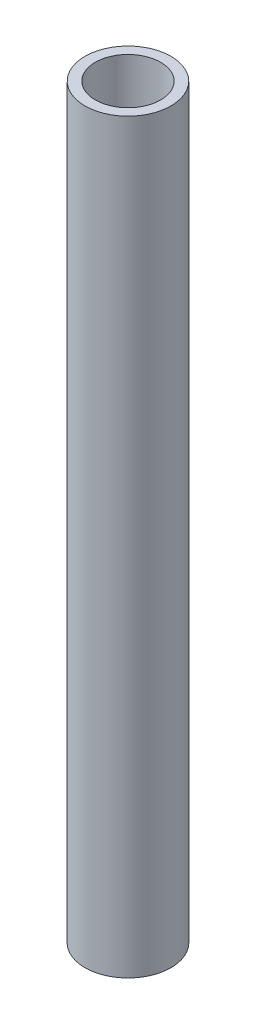
ISO-10303-21;
HEADER;
FILE_DESCRIPTION(('STEP AP214'),'2;1');
FILE_NAME('part.step','',(''),(''),'','','');
FILE_SCHEMA(('AUTOMOTIVE_DESIGN { 1 0 10303 214 1 1 1 1 }'));
ENDSEC;
DATA;
#1=APPLICATION_CONTEXT('core data for automotive mechanical design processes');
#2=APPLICATION_PROTOCOL_DEFINITION('international standard','automotive_design',2000,#1);
#3=PRODUCT_CONTEXT('',#1,'mechanical');
#4=PRODUCT('Part','Part','',(#3));
#5=PRODUCT_RELATED_PRODUCT_CATEGORY('part','',(#4));
#6=PRODUCT_DEFINITION_FORMATION('','',#4);
#7=PRODUCT_DEFINITION_CONTEXT('part definition',#1,'design');
#8=PRODUCT_DEFINITION('design','',#6,#7);
#9=PRODUCT_DEFINITION_SHAPE('','',#8);
#10=(LENGTH_UNIT() NAMED_UNIT(*) SI_UNIT(.MILLI.,.METRE.));
#11=(NAMED_UNIT(*) PLANE_ANGLE_UNIT() SI_UNIT($,.RADIAN.));
#12=(NAMED_UNIT(*) SI_UNIT($,.STERADIAN.) SOLID_ANGLE_UNIT());
#13=UNCERTAINTY_MEASURE_WITH_UNIT(LENGTH_MEASURE(1.E-05),#10,'distance_accuracy_value','');
#14=(GEOMETRIC_REPRESENTATION_CONTEXT(3) GLOBAL_UNCERTAINTY_ASSIGNED_CONTEXT((#13)) GLOBAL_UNIT_ASSIGNED_CONTEXT((#10,
#11,#12)) REPRESENTATION_CONTEXT('',''));
#15=CARTESIAN_POINT('',(0.,0.,0.));
#16=DIRECTION('',(0.,0.,1.));
#17=DIRECTION('',(1.,0.,0.));
#18=AXIS2_PLACEMENT_3D('',#15,#16,#17);
#19=CARTESIAN_POINT('',(0.,217.,0.));
#20=DIRECTION('',(0.,1.,0.));
#21=DIRECTION('',(0.,0.,1.));
#22=AXIS2_PLACEMENT_3D('',#19,#20,#21);
#23=PLANE('',#22);
#24=CARTESIAN_POINT('',(0.,217.,0.));
#25=DIRECTION('',(0.,1.,0.));
#26=DIRECTION('',(0.,0.,1.));
#27=AXIS2_PLACEMENT_3D('',#24,#25,#26);
#28=CIRCLE('',#27,12.5);
#29=CARTESIAN_POINT('',(0.,217.,12.5));
#30=VERTEX_POINT('',#29);
#31=EDGE_CURVE('E10',#30,#30,#28,.T.);
#32=ORIENTED_EDGE('',*,*,#31,.T.);
#33=EDGE_LOOP('',(#32));
#34=FACE_BOUND('',#33,.T.);
#35=CARTESIAN_POINT('',(0.,217.,0.));
#36=DIRECTION('',(0.,1.,0.));
#37=DIRECTION('',(0.,0.,1.));
#38=AXIS2_PLACEMENT_3D('',#35,#36,#37);
#39=CIRCLE('',#38,9.5);
#40=CARTESIAN_POINT('',(0.,217.,9.5));
#41=VERTEX_POINT('',#40);
#42=EDGE_CURVE('E51',#41,#41,#39,.T.);
#43=ORIENTED_EDGE('',*,*,#42,.F.);
#44=EDGE_LOOP('',(#43));
#45=FACE_BOUND('',#44,.T.);
#46=ADVANCED_FACE('F32',(#34,#45),#23,.T.);
#47=CARTESIAN_POINT('',(0.,0.,0.));
#48=DIRECTION('',(0.,1.,0.));
#49=DIRECTION('',(0.,0.,1.));
#50=AXIS2_PLACEMENT_3D('',#47,#48,#49);
#51=PLANE('',#50);
#52=CARTESIAN_POINT('',(0.,0.,0.));
#53=DIRECTION('',(0.,1.,0.));
#54=DIRECTION('',(0.,0.,1.));
#55=AXIS2_PLACEMENT_3D('',#52,#53,#54);
#56=CIRCLE('',#55,12.5);
#57=CARTESIAN_POINT('',(0.,0.,12.5));
#58=VERTEX_POINT('',#57);
#59=EDGE_CURVE('E46',#58,#58,#56,.T.);
#60=ORIENTED_EDGE('',*,*,#59,.F.);
#61=EDGE_LOOP('',(#60));
#62=FACE_BOUND('',#61,.T.);
#63=CARTESIAN_POINT('',(0.,0.,0.));
#64=DIRECTION('',(0.,1.,0.));
#65=DIRECTION('',(0.,0.,1.));
#66=AXIS2_PLACEMENT_3D('',#63,#64,#65);
#67=CIRCLE('',#66,9.5);
#68=CARTESIAN_POINT('',(0.,0.,9.5));
#69=VERTEX_POINT('',#68);
#70=EDGE_CURVE('E53',#69,#69,#67,.T.);
#71=ORIENTED_EDGE('',*,*,#70,.T.);
#72=EDGE_LOOP('',(#71));
#73=FACE_BOUND('',#72,.T.);
#74=ADVANCED_FACE('F74',(#62,#73),#51,.F.);
#75=CARTESIAN_POINT('',(0.,217.,0.));
#76=DIRECTION('',(0.,-1.,0.));
#77=DIRECTION('',(0.,0.,-1.));
#78=AXIS2_PLACEMENT_3D('',#75,#76,#77);
#79=CYLINDRICAL_SURFACE('',#78,12.5);
#80=CARTESIAN_POINT('',(0.,205.,-12.5));
#81=CARTESIAN_POINT('',(-0.165963929028716,204.999994975923,-12.4999970714968));
#82=CARTESIAN_POINT('',(-0.331985420928068,204.986181589764,-12.4966615634859));
#83=CARTESIAN_POINT('',(-0.659284290971382,204.931367260405,-12.4836783946933));
#84=CARTESIAN_POINT('',(-0.820558683214276,204.890349572005,-12.4740268462166));
#85=CARTESIAN_POINT('',(-1.13358839471402,204.782507665496,-12.4494823208195));
#86=CARTESIAN_POINT('',(-1.28535442324823,204.715713110142,-12.4345953702841));
#87=CARTESIAN_POINT('',(-1.57552517879764,204.558314563554,-12.4011725442513));
#88=CARTESIAN_POINT('',(-1.71392971475167,204.467710231923,-12.3826366165873));
#89=CARTESIAN_POINT('',(-1.97609263393973,204.263435821624,-12.3435386014785));
#90=CARTESIAN_POINT('',(-2.09955952100481,204.149397218951,-12.3229472454311));
#91=CARTESIAN_POINT('',(-2.32581080811943,203.902281130935,-12.2822574370147));
#92=CARTESIAN_POINT('',(-2.4285930462449,203.769201657959,-12.2621590363612));
#93=CARTESIAN_POINT('',(-2.61189993555015,203.485554166983,-12.224437969062));
#94=CARTESIAN_POINT('',(-2.69210377047565,203.334773416241,-12.2068525815312));
#95=CARTESIAN_POINT('',(-2.82591582947333,203.021380164872,-12.1765733412448));
#96=CARTESIAN_POINT('',(-2.87952794169564,202.858769397977,-12.1638787734309));
#97=CARTESIAN_POINT('',(-2.95765058108663,202.529523426731,-12.1451184675007));
#98=CARTESIAN_POINT('',(-2.98268262400617,202.363018878475,-12.1389341034343));
#99=CARTESIAN_POINT('',(-3.00455808879087,202.028067620357,-12.1335389605945));
#100=CARTESIAN_POINT('',(-3.001405716824,201.859621204043,-12.1343271412568));
#101=CARTESIAN_POINT('',(-2.96741912081942,201.529524033987,-12.1426811387008));
#102=CARTESIAN_POINT('',(-2.93720103400494,201.36780543481,-12.1500960921292));
#103=CARTESIAN_POINT('',(-2.85092141637188,201.051802683352,-12.1706283738785));
#104=CARTESIAN_POINT('',(-2.79485817372027,200.897519024266,-12.1837460799133));
#105=CARTESIAN_POINT('',(-2.65794121231783,200.599087021916,-12.2143476734445));
#106=CARTESIAN_POINT('',(-2.57685948246961,200.455047547083,-12.2318714325758));
#107=CARTESIAN_POINT('',(-2.39236688956384,200.182395499277,-12.2692875046196));
#108=CARTESIAN_POINT('',(-2.28895240342649,200.053785434715,-12.2891802016137));
#109=CARTESIAN_POINT('',(-2.05951493908849,199.812106429681,-12.329732025739));
#110=CARTESIAN_POINT('',(-1.9329706438991,199.699532900938,-12.3503975788014));
#111=CARTESIAN_POINT('',(-1.66255592459693,199.497115280254,-12.3896951594929));
#112=CARTESIAN_POINT('',(-1.51868504982142,199.407271779707,-12.4083271342049));
#113=CARTESIAN_POINT('',(-1.21702847718582,199.252702779387,-12.4415394956922));
#114=CARTESIAN_POINT('',(-1.05920278696055,199.188052543762,-12.4561077058019));
#115=CARTESIAN_POINT('',(-0.734497606078679,199.086334920951,-12.4794620474154));
#116=CARTESIAN_POINT('',(-0.567619713387665,199.049262682373,-12.4882491958651));
#117=CARTESIAN_POINT('',(-0.233787399651664,199.004497935348,-12.4989027542709));
#118=CARTESIAN_POINT('',(-0.0669284805450043,198.996130107538,-12.5009282130753));
#119=CARTESIAN_POINT('',(0.265804381586635,199.007166766851,-12.4982807419474));
#120=CARTESIAN_POINT('',(0.431678404764957,199.026568961987,-12.4936083648176));
#121=CARTESIAN_POINT('',(0.755422580108857,199.092036978516,-12.4781916395217));
#122=CARTESIAN_POINT('',(0.913370579311319,199.137739109574,-12.4675301590363));
#123=CARTESIAN_POINT('',(1.21935330013478,199.254098191695,-12.4413335015664));
#124=CARTESIAN_POINT('',(1.36738706664151,199.324757542978,-12.4257978558334));
#125=CARTESIAN_POINT('',(1.6520615099557,199.490366593598,-12.3911910149582));
#126=CARTESIAN_POINT('',(1.78847176740355,199.585700716924,-12.3720653178033));
#127=CARTESIAN_POINT('',(2.04359904096632,199.797456929013,-12.3324936406987));
#128=CARTESIAN_POINT('',(2.16231325074336,199.913882356081,-12.3120474520734));
#129=CARTESIAN_POINT('',(2.38142453789942,200.167640831209,-12.2715742142771));
#130=CARTESIAN_POINT('',(2.48134974047371,200.305385122082,-12.2515669262668));
#131=CARTESIAN_POINT('',(2.65666020824083,200.596090427897,-12.2147538797452));
#132=CARTESIAN_POINT('',(2.73204657223351,200.749050761094,-12.1979479778962));
#133=CARTESIAN_POINT('',(2.85558993518172,201.065012513544,-12.1696189519335));
#134=CARTESIAN_POINT('',(2.90390754385905,201.227948203421,-12.1580647463107));
#135=CARTESIAN_POINT('',(2.97238380283979,201.559946185021,-12.1415072663683));
#136=CARTESIAN_POINT('',(2.99254804274991,201.729007253762,-12.1365026916888));
#137=CARTESIAN_POINT('',(3.00387066449354,202.063670700281,-12.1337046220624));
#138=CARTESIAN_POINT('',(2.99578106592266,202.229246496327,-12.1357241633848));
#139=CARTESIAN_POINT('',(2.95253345626267,202.556599764224,-12.1463176460425));
#140=CARTESIAN_POINT('',(2.91737590900096,202.718377301111,-12.1548914750658));
#141=CARTESIAN_POINT('',(2.82138591303537,203.032797552548,-12.1775274976748));
#142=CARTESIAN_POINT('',(2.76068402045612,203.185482272584,-12.191561756094));
#143=CARTESIAN_POINT('',(2.61543373580583,203.478604413884,-12.2235433612686));
#144=CARTESIAN_POINT('',(2.53088229934855,203.619040268586,-12.2414912075257));
#145=CARTESIAN_POINT('',(2.33793007708464,203.88733700012,-12.279819325529));
#146=CARTESIAN_POINT('',(2.22900267979019,204.014812323099,-12.3002478697533));
#147=CARTESIAN_POINT('',(1.99143074773236,204.249919988052,-12.3409359831145));
#148=CARTESIAN_POINT('',(1.86278158874233,204.35754766321,-12.361195511444));
#149=CARTESIAN_POINT('',(1.58688299880138,204.551609259555,-12.3996570299581));
#150=CARTESIAN_POINT('',(1.439364143594,204.637668405442,-12.4178200201219));
#151=CARTESIAN_POINT('',(1.13153622828565,204.783629532748,-12.4496380610582));
#152=CARTESIAN_POINT('',(0.971236973691203,204.843551343392,-12.4632965272855));
#153=CARTESIAN_POINT('',(0.67588702569475,204.926038625138,-12.4824059901497));
#154=CARTESIAN_POINT('',(0.542312066268408,204.953716615786,-12.4889599449579));
#155=CARTESIAN_POINT('',(0.272504227478243,204.990698780852,-12.4977580149525));
#156=CARTESIAN_POINT('',(0.136271517915774,205.000004125226,-12.5000024045682));
#157=CARTESIAN_POINT('',(0.,205.,-12.5));
#158=B_SPLINE_CURVE_WITH_KNOTS('',3,(#80,#81,#82,#83,#84,#85,#86,#87,#88,#89,#90,#91,#92,#93,
#94,#95,#96,#97,#98,#99,#100,#101,#102,#103,#104,#105,#106,#107,#108,#109,#110,#111,#112,#113,
#114,#115,#116,#117,#118,#119,#120,#121,#122,#123,#124,#125,#126,#127,#128,#129,#130,#131,#132,
#133,#134,#135,#136,#137,#138,#139,#140,#141,#142,#143,#144,#145,#146,#147,#148,#149,#150,#151,
#152,#153,#154,#155,#156,#157),.UNSPECIFIED.,.T.,.F.,(4,2,2,2,2,2,2,2,2,2,2,2,2,2,2,2,2,2,2,2,2,
2,2,2,2,2,2,2,2,2,2,2,2,2,2,2,2,2,4),(0.,0.497392599366678,0.995091645758828,1.49221966408503,
1.98935478998521,2.49500570148358,3.00070943533307,3.51327262050848,4.02576083835036,
4.52873995359111,5.03164400680469,5.52338274964841,6.01515406709136,6.51154667521171,
7.00801987450002,7.51749958381933,8.0269925475217,8.53799614678203,9.04890983140416,
9.54771776810827,10.0464845383097,10.5385143736981,11.0305915421211,11.5308523313794,
12.031192370573,12.5427824523193,13.0543496229378,13.5628484119093,14.0712462285019,
14.5662165454702,15.06117838098,15.5536406351284,16.0461657803879,16.5505844610431,
17.055121595827,17.5678974206352,18.0802835459069,18.4887142303991,18.897118905514),.UNSPECIFIED.);
#159=CARTESIAN_POINT('',(0.,205.,-12.5));
#160=VERTEX_POINT('',#159);
#161=EDGE_CURVE('E56',#160,#160,#158,.T.);
#162=ORIENTED_EDGE('',*,*,#161,.T.);
#163=EDGE_LOOP('',(#162));
#164=FACE_BOUND('',#163,.T.);
#165=ORIENTED_EDGE('',*,*,#31,.F.);
#166=EDGE_LOOP('',(#165));
#167=FACE_BOUND('',#166,.T.);
#168=ORIENTED_EDGE('',*,*,#59,.T.);
#169=EDGE_LOOP('',(#168));
#170=FACE_BOUND('',#169,.T.);
#171=ADVANCED_FACE('F34',(#164,#167,#170),#79,.T.);
#172=CARTESIAN_POINT('',(0.,217.,0.));
#173=DIRECTION('',(0.,-1.,0.));
#174=DIRECTION('',(0.,0.,-1.));
#175=AXIS2_PLACEMENT_3D('',#172,#173,#174);
#176=CYLINDRICAL_SURFACE('',#175,9.5);
#177=CARTESIAN_POINT('',(0.,205.,-9.5));
#178=CARTESIAN_POINT('',(-0.164167089462808,204.999999192006,-9.49999935809229));
#179=CARTESIAN_POINT('',(-0.328342993003652,204.986480261011,-9.49570457873447));
#180=CARTESIAN_POINT('',(-0.651888233262993,204.932907101554,-9.47899296182889));
#181=CARTESIAN_POINT('',(-0.811256566918247,204.892847375045,-9.46657444141809));
#182=CARTESIAN_POINT('',(-1.12047453900869,204.787682087632,-9.43497086374047));
#183=CARTESIAN_POINT('',(-1.2703386681819,204.722615777786,-9.4157964146812));
#184=CARTESIAN_POINT('',(-1.55702915841443,204.569452927143,-9.37265725199131));
#185=CARTESIAN_POINT('',(-1.69385337678599,204.481352610323,-9.34869175310374));
#186=CARTESIAN_POINT('',(-1.954886157509,204.281705325147,-9.29766753324294));
#187=CARTESIAN_POINT('',(-2.07862693177764,204.169564302526,-9.2705403669451));
#188=CARTESIAN_POINT('',(-2.3058948522785,203.926283439754,-9.21664353803553));
#189=CARTESIAN_POINT('',(-2.40941813390019,203.795139975581,-9.18987394468381));
#190=CARTESIAN_POINT('',(-2.59586933707153,203.513502435768,-9.1389859370637));
#191=CARTESIAN_POINT('',(-2.67820924038344,203.362602393112,-9.11495183979177));
#192=CARTESIAN_POINT('',(-2.81614778654471,203.048215076448,-9.07328724171044));
#193=CARTESIAN_POINT('',(-2.87175364335561,202.884731211909,-9.05565501372426));
#194=CARTESIAN_POINT('',(-2.9529272821257,202.555102195261,-9.02950721227384));
#195=CARTESIAN_POINT('',(-2.97936420548709,202.389192531182,-9.02072856266505));
#196=CARTESIAN_POINT('',(-3.00416514791963,202.05507820356,-9.01250122204869));
#197=CARTESIAN_POINT('',(-3.00253681210414,201.886874177487,-9.01304999020652));
#198=CARTESIAN_POINT('',(-2.97193247609429,201.560168962322,-9.02318352274045));
#199=CARTESIAN_POINT('',(-2.94406576248244,201.401550567518,-9.03240174793261));
#200=CARTESIAN_POINT('',(-2.86357596011184,201.091366945115,-9.05823941484151));
#201=CARTESIAN_POINT('',(-2.81095018945964,200.93980248355,-9.07485965833217));
#202=CARTESIAN_POINT('',(-2.68166168169204,200.645405464249,-9.11390651918069));
#203=CARTESIAN_POINT('',(-2.60465367716268,200.50273595369,-9.13641567799888));
#204=CARTESIAN_POINT('',(-2.42902643383231,200.231982351301,-9.1846668373259));
#205=CARTESIAN_POINT('',(-2.33040148183896,200.103902128931,-9.21040969170622));
#206=CARTESIAN_POINT('',(-2.10891443526094,199.859697277003,-9.26369376405774));
#207=CARTESIAN_POINT('',(-1.98513792318252,199.744406541852,-9.29126291800172));
#208=CARTESIAN_POINT('',(-1.71966506786239,199.53601351946,-9.34403785217591));
#209=CARTESIAN_POINT('',(-1.57796734157916,199.442912946311,-9.36924344974064));
#210=CARTESIAN_POINT('',(-1.27904248860848,199.28096191105,-9.41472566771743));
#211=CARTESIAN_POINT('',(-1.12169880645912,199.212314107951,-9.43496068381886));
#212=CARTESIAN_POINT('',(-0.796908546050014,199.102710444396,-9.46792126212738));
#213=CARTESIAN_POINT('',(-0.629465120716916,199.061745990021,-9.48064915466278));
#214=CARTESIAN_POINT('',(-0.296303884002123,199.010101081722,-9.49678470779038));
#215=CARTESIAN_POINT('',(-0.130777575905979,198.998292068395,-9.50053950796354));
#216=CARTESIAN_POINT('',(0.19991137896084,199.002106234833,-9.49933471585785));
#217=CARTESIAN_POINT('',(0.365074076408763,199.017725312924,-9.49437642655838));
#218=CARTESIAN_POINT('',(0.685969212904214,199.075048179768,-9.47653086922814));
#219=CARTESIAN_POINT('',(0.841834706561398,199.116077182559,-9.46384885282509));
#220=CARTESIAN_POINT('',(1.14442314350255,199.222228746273,-9.43204434547225));
#221=CARTESIAN_POINT('',(1.2911449480725,199.287354301094,-9.41292105424678));
#222=CARTESIAN_POINT('',(1.57531276244697,199.441646180127,-9.36960895031318));
#223=CARTESIAN_POINT('',(1.71244019799074,199.531366514146,-9.34530669896614));
#224=CARTESIAN_POINT('',(1.97006979650918,199.731638642252,-9.29441218727718));
#225=CARTESIAN_POINT('',(2.09056734431474,199.842196199082,-9.26781929454284));
#226=CARTESIAN_POINT('',(2.31658675579944,200.086313193485,-9.21398298633844));
#227=CARTESIAN_POINT('',(2.42130400734894,200.220623121143,-9.186756871098));
#228=CARTESIAN_POINT('',(2.60679013327421,200.505500077087,-9.13585946270641));
#229=CARTESIAN_POINT('',(2.68755931108111,200.656066899359,-9.11218812451676));
#230=CARTESIAN_POINT('',(2.8223709751743,200.968923897761,-9.07133925816319));
#231=CARTESIAN_POINT('',(2.87651039405967,201.131169053849,-9.05413823262218));
#232=CARTESIAN_POINT('',(2.95649944180757,201.463129600245,-9.0283393693878));
#233=CARTESIAN_POINT('',(2.98236013155669,201.632842042776,-9.01973816808891));
#234=CARTESIAN_POINT('',(3.0042524121147,201.96649385186,-9.01246833575292));
#235=CARTESIAN_POINT('',(3.00160628169283,202.130337919997,-9.01335938768915));
#236=CARTESIAN_POINT('',(2.96976166390158,202.455123315773,-9.02390107112083));
#237=CARTESIAN_POINT('',(2.94056446477843,202.616064783858,-9.0335512776259));
#238=CARTESIAN_POINT('',(2.85733979857869,202.928056941565,-9.06021304876319));
#239=CARTESIAN_POINT('',(2.80369834624607,203.079221145577,-9.07710994083738));
#240=CARTESIAN_POINT('',(2.67341300631293,203.370523991578,-9.11632984499269));
#241=CARTESIAN_POINT('',(2.59676436934434,203.510660349545,-9.13865397723677));
#242=CARTESIAN_POINT('',(2.41907080260918,203.781973490595,-9.1873223558432));
#243=CARTESIAN_POINT('',(2.31717569257862,203.912571016537,-9.21379131671489));
#244=CARTESIAN_POINT('',(2.09336848130777,204.155241675261,-9.26720162412938));
#245=CARTESIAN_POINT('',(1.97145098067161,204.267309794854,-9.29414309633804));
#246=CARTESIAN_POINT('',(1.7061326528479,204.47351384861,-9.34654886057908));
#247=CARTESIAN_POINT('',(1.56214764703045,204.566920781459,-9.37193310874742));
#248=CARTESIAN_POINT('',(1.25971894568572,204.728083368742,-9.41734758486009));
#249=CARTESIAN_POINT('',(1.10128066394409,204.795848579269,-9.43737980656471));
#250=CARTESIAN_POINT('',(0.787271829955636,204.899197538206,-9.468532861615));
#251=CARTESIAN_POINT('',(0.63245026637288,204.936887759171,-9.48022921021867));
#252=CARTESIAN_POINT('',(0.318421271901135,204.987286725329,-9.49596227615521));
#253=CARTESIAN_POINT('',(0.159214781112171,205.00000078362,-9.50000062254375));
#254=CARTESIAN_POINT('',(0.,205.,-9.5));
#255=B_SPLINE_CURVE_WITH_KNOTS('',3,(#177,#178,#179,#180,#181,#182,#183,#184,#185,#186,#187,
#188,#189,#190,#191,#192,#193,#194,#195,#196,#197,#198,#199,#200,#201,#202,#203,#204,#205,#206,
#207,#208,#209,#210,#211,#212,#213,#214,#215,#216,#217,#218,#219,#220,#221,#222,#223,#224,#225,
#226,#227,#228,#229,#230,#231,#232,#233,#234,#235,#236,#237,#238,#239,#240,#241,#242,#243,#244,
#245,#246,#247,#248,#249,#250,#251,#252,#253,#254),.UNSPECIFIED.,.T.,.F.,(4,2,2,2,2,2,2,2,2,2,2,
2,2,2,2,2,2,2,2,2,2,2,2,2,2,2,2,2,2,2,2,2,2,2,2,2,2,2,4),(0.,0.49191594170538,0.983933817902438,
1.47518254201799,1.9665118483056,2.47177433217166,2.97713330355079,3.49529138086526,
4.01330955891891,4.51543663249029,5.0174269263623,5.49910423633607,5.98083373346493,
6.46971527661729,6.95872618352227,7.4704969481296,7.98230723196768,8.49826565849846,
9.01406383907483,9.50955937080917,10.0049808110835,10.487778781206,10.9706367571643,
11.465419823793,11.9603399289468,12.4753133176055,12.9902801810781,13.5033584262729,
14.0162359151874,14.5054301927743,14.9946007361353,15.4763007218675,15.9581002132873,
16.4590917155026,16.9602185415511,17.4781824310863,17.9959530965539,18.4731312898967,
18.9502079636715),.UNSPECIFIED.);
#256=CARTESIAN_POINT('',(0.,205.,-9.5));
#257=VERTEX_POINT('',#256);
#258=EDGE_CURVE('E37',#257,#257,#255,.T.);
#259=ORIENTED_EDGE('',*,*,#258,.F.);
#260=EDGE_LOOP('',(#259));
#261=FACE_BOUND('',#260,.T.);
#262=ORIENTED_EDGE('',*,*,#42,.T.);
#263=EDGE_LOOP('',(#262));
#264=FACE_BOUND('',#263,.T.);
#265=ORIENTED_EDGE('',*,*,#70,.F.);
#266=EDGE_LOOP('',(#265));
#267=FACE_BOUND('',#266,.T.);
#268=ADVANCED_FACE('F66',(#261,#264,#267),#176,.F.);
#269=CARTESIAN_POINT('',(0.,202.,-12.5));
#270=DIRECTION('',(0.,0.,1.));
#271=DIRECTION('',(1.,0.,0.));
#272=AXIS2_PLACEMENT_3D('',#269,#270,#271);
#273=CYLINDRICAL_SURFACE('',#272,3.);
#274=ORIENTED_EDGE('',*,*,#258,.T.);
#275=EDGE_LOOP('',(#274));
#276=FACE_BOUND('',#275,.T.);
#277=ORIENTED_EDGE('',*,*,#161,.F.);
#278=EDGE_LOOP('',(#277));
#279=FACE_BOUND('',#278,.T.);
#280=ADVANCED_FACE('F63',(#276,#279),#273,.F.);
#281=CLOSED_SHELL('',(#46,#74,#171,#268,#280));
#282=MANIFOLD_SOLID_BREP('B2',#281);
#283=ADVANCED_BREP_SHAPE_REPRESENTATION('',(#18,#282),#14);
#284=SHAPE_DEFINITION_REPRESENTATION(#9,#283);
ENDSEC;
END-ISO-10303-21;
